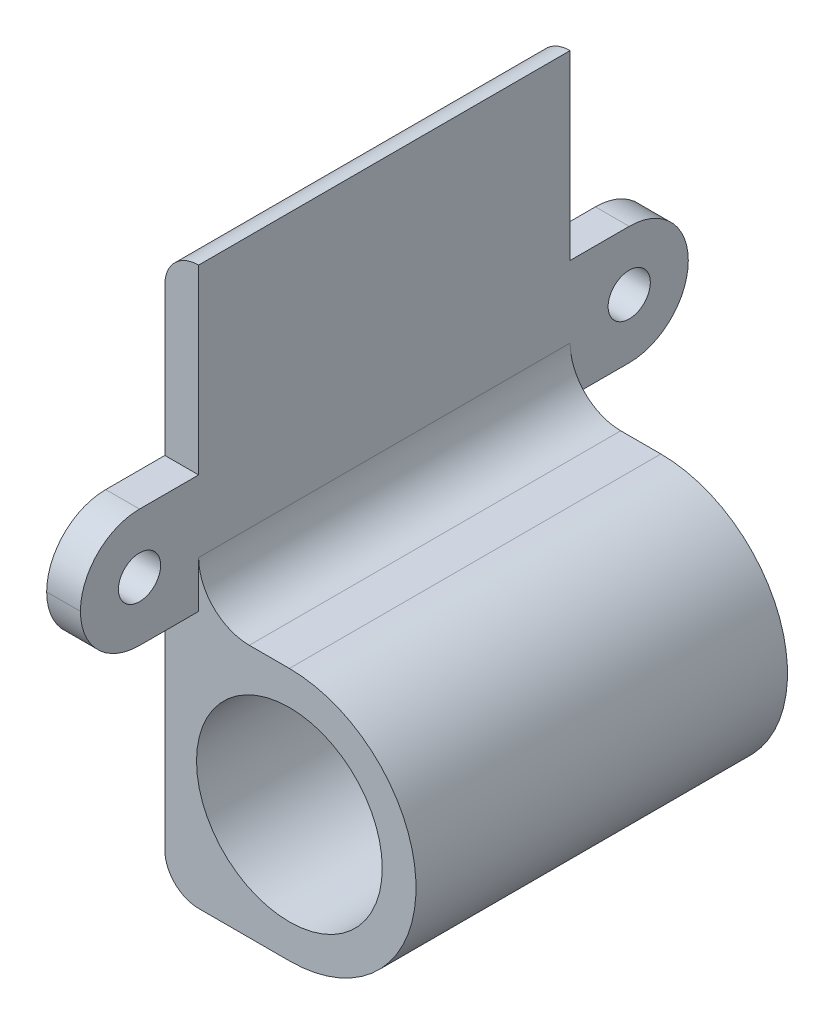
ISO-10303-21;
HEADER;
FILE_DESCRIPTION(('STEP AP214'),'2;1');
FILE_NAME('part.step','',(''),(''),'','','');
FILE_SCHEMA(('AUTOMOTIVE_DESIGN { 1 0 10303 214 1 1 1 1 }'));
ENDSEC;
DATA;
#1=APPLICATION_CONTEXT('core data for automotive mechanical design processes');
#2=APPLICATION_PROTOCOL_DEFINITION('international standard','automotive_design',2000,#1);
#3=PRODUCT_CONTEXT('',#1,'mechanical');
#4=PRODUCT('Part','Part','',(#3));
#5=PRODUCT_RELATED_PRODUCT_CATEGORY('part','',(#4));
#6=PRODUCT_DEFINITION_FORMATION('','',#4);
#7=PRODUCT_DEFINITION_CONTEXT('part definition',#1,'design');
#8=PRODUCT_DEFINITION('design','',#6,#7);
#9=PRODUCT_DEFINITION_SHAPE('','',#8);
#10=(LENGTH_UNIT() NAMED_UNIT(*) SI_UNIT(.MILLI.,.METRE.));
#11=(NAMED_UNIT(*) PLANE_ANGLE_UNIT() SI_UNIT($,.RADIAN.));
#12=(NAMED_UNIT(*) SI_UNIT($,.STERADIAN.) SOLID_ANGLE_UNIT());
#13=UNCERTAINTY_MEASURE_WITH_UNIT(LENGTH_MEASURE(1.E-05),#10,'distance_accuracy_value','');
#14=(GEOMETRIC_REPRESENTATION_CONTEXT(3) GLOBAL_UNCERTAINTY_ASSIGNED_CONTEXT((#13)) GLOBAL_UNIT_ASSIGNED_CONTEXT((#10,
#11,#12)) REPRESENTATION_CONTEXT('',''));
#15=CARTESIAN_POINT('',(0.,0.,0.));
#16=DIRECTION('',(0.,0.,1.));
#17=DIRECTION('',(1.,0.,0.));
#18=AXIS2_PLACEMENT_3D('',#15,#16,#17);
#19=CARTESIAN_POINT('',(14.75,15.,0.));
#20=DIRECTION('',(0.,0.,1.));
#21=DIRECTION('',(1.,0.,0.));
#22=AXIS2_PLACEMENT_3D('',#19,#20,#21);
#23=PLANE('',#22);
#24=CARTESIAN_POINT('',(14.75,15.,0.));
#25=DIRECTION('',(0.,0.,1.));
#26=DIRECTION('',(1.,0.,0.));
#27=AXIS2_PLACEMENT_3D('',#24,#25,#26);
#28=CIRCLE('',#27,11.);
#29=CARTESIAN_POINT('',(25.75,15.,0.));
#30=VERTEX_POINT('',#29);
#31=EDGE_CURVE('E296',#30,#30,#28,.T.);
#32=ORIENTED_EDGE('',*,*,#31,.T.);
#33=EDGE_LOOP('',(#32));
#34=FACE_BOUND('',#33,.T.);
#35=DIRECTION('',(0.,-1.,0.));
#36=VECTOR('',#35,1.);
#37=CARTESIAN_POINT('',(0.,4.,0.));
#38=LINE('',#37,#36);
#39=CARTESIAN_POINT('',(0.,30.4737170086074,0.));
#40=VERTEX_POINT('',#39);
#41=CARTESIAN_POINT('',(0.,4.,0.));
#42=VERTEX_POINT('',#41);
#43=EDGE_CURVE('E190',#40,#42,#38,.T.);
#44=ORIENTED_EDGE('',*,*,#43,.F.);
#45=DIRECTION('',(1.,0.,0.));
#46=VECTOR('',#45,1.);
#47=CARTESIAN_POINT('',(0.,30.4737170086074,0.));
#48=LINE('',#47,#46);
#49=CARTESIAN_POINT('',(4.,30.4737170086074,0.));
#50=VERTEX_POINT('',#49);
#51=EDGE_CURVE('E271',#40,#50,#48,.T.);
#52=ORIENTED_EDGE('',*,*,#51,.T.);
#53=DIRECTION('',(0.,1.,0.));
#54=VECTOR('',#53,1.);
#55=CARTESIAN_POINT('',(4.,30.4737170086074,0.));
#56=LINE('',#55,#54);
#57=CARTESIAN_POINT('',(4.,36.,0.));
#58=VERTEX_POINT('',#57);
#59=EDGE_CURVE('E182',#50,#58,#56,.T.);
#60=ORIENTED_EDGE('',*,*,#59,.T.);
#61=CARTESIAN_POINT('',(10.,36.,0.));
#62=DIRECTION('',(0.,0.,-1.));
#63=DIRECTION('',(1.,0.,0.));
#64=AXIS2_PLACEMENT_3D('',#61,#62,#63);
#65=CIRCLE('',#64,6.);
#66=CARTESIAN_POINT('',(10.0000000000001,30.,0.));
#67=VERTEX_POINT('',#66);
#68=EDGE_CURVE('E188',#67,#58,#65,.T.);
#69=ORIENTED_EDGE('',*,*,#68,.F.);
#70=DIRECTION('',(-1.,0.,0.));
#71=VECTOR('',#70,1.);
#72=CARTESIAN_POINT('',(14.75,30.,0.));
#73=LINE('',#72,#71);
#74=CARTESIAN_POINT('',(14.75,30.,0.));
#75=VERTEX_POINT('',#74);
#76=EDGE_CURVE('E193',#75,#67,#73,.T.);
#77=ORIENTED_EDGE('',*,*,#76,.F.);
#78=CARTESIAN_POINT('',(14.75,15.,0.));
#79=DIRECTION('',(0.,0.,1.));
#80=DIRECTION('',(1.,0.,0.));
#81=AXIS2_PLACEMENT_3D('',#78,#79,#80);
#82=CIRCLE('',#81,15.);
#83=CARTESIAN_POINT('',(14.75,0.,0.));
#84=VERTEX_POINT('',#83);
#85=EDGE_CURVE('E203',#84,#75,#82,.T.);
#86=ORIENTED_EDGE('',*,*,#85,.F.);
#87=DIRECTION('',(1.,0.,0.));
#88=VECTOR('',#87,1.);
#89=CARTESIAN_POINT('',(14.75,0.,0.));
#90=LINE('',#89,#88);
#91=CARTESIAN_POINT('',(4.,0.,0.));
#92=VERTEX_POINT('',#91);
#93=EDGE_CURVE('E201',#92,#84,#90,.T.);
#94=ORIENTED_EDGE('',*,*,#93,.F.);
#95=CARTESIAN_POINT('',(4.,4.,0.));
#96=DIRECTION('',(0.,0.,1.));
#97=DIRECTION('',(1.,0.,0.));
#98=AXIS2_PLACEMENT_3D('',#95,#96,#97);
#99=CIRCLE('',#98,4.);
#100=EDGE_CURVE('E199',#42,#92,#99,.T.);
#101=ORIENTED_EDGE('',*,*,#100,.F.);
#102=EDGE_LOOP('',(#44,#52,#60,#69,#77,#86,#94,#101));
#103=FACE_BOUND('',#102,.T.);
#104=ADVANCED_FACE('F39',(#34,#103),#23,.F.);
#105=CARTESIAN_POINT('',(14.75,15.,44.));
#106=DIRECTION('',(0.,0.,1.));
#107=DIRECTION('',(1.,0.,0.));
#108=AXIS2_PLACEMENT_3D('',#105,#106,#107);
#109=PLANE('',#108);
#110=DIRECTION('',(-1.,0.,0.));
#111=VECTOR('',#110,1.);
#112=CARTESIAN_POINT('',(0.,44.4737170086074,44.));
#113=LINE('',#112,#111);
#114=CARTESIAN_POINT('',(4.00000000000003,44.4737170086074,44.));
#115=VERTEX_POINT('',#114);
#116=CARTESIAN_POINT('',(0.,44.4737170086074,44.));
#117=VERTEX_POINT('',#116);
#118=EDGE_CURVE('E285',#115,#117,#113,.T.);
#119=ORIENTED_EDGE('',*,*,#118,.F.);
#120=DIRECTION('',(0.,1.,0.));
#121=VECTOR('',#120,1.);
#122=CARTESIAN_POINT('',(4.00000000000003,66.,44.));
#123=LINE('',#122,#121);
#124=CARTESIAN_POINT('',(4.00000000000003,66.,44.));
#125=VERTEX_POINT('',#124);
#126=EDGE_CURVE('E308',#115,#125,#123,.T.);
#127=ORIENTED_EDGE('',*,*,#126,.T.);
#128=CARTESIAN_POINT('',(4.,62.,44.));
#129=DIRECTION('',(0.,0.,1.));
#130=DIRECTION('',(-1.,0.,0.));
#131=AXIS2_PLACEMENT_3D('',#128,#129,#130);
#132=CIRCLE('',#131,4.);
#133=CARTESIAN_POINT('',(0.,62.,44.));
#134=VERTEX_POINT('',#133);
#135=EDGE_CURVE('E310',#125,#134,#132,.T.);
#136=ORIENTED_EDGE('',*,*,#135,.T.);
#137=DIRECTION('',(0.,-1.,0.));
#138=VECTOR('',#137,1.);
#139=CARTESIAN_POINT('',(0.,4.,44.));
#140=LINE('',#139,#138);
#141=EDGE_CURVE('E313',#134,#117,#140,.T.);
#142=ORIENTED_EDGE('',*,*,#141,.T.);
#143=EDGE_LOOP('',(#119,#127,#136,#142));
#144=FACE_BOUND('',#143,.T.);
#145=ADVANCED_FACE('F374',(#144),#109,.T.);
#146=DIRECTION('',(0.,1.,0.));
#147=VECTOR('',#146,1.);
#148=CARTESIAN_POINT('',(4.,30.4737170086074,44.));
#149=LINE('',#148,#147);
#150=CARTESIAN_POINT('',(4.,30.4737170086074,44.));
#151=VERTEX_POINT('',#150);
#152=CARTESIAN_POINT('',(4.00000000000003,36.,44.));
#153=VERTEX_POINT('',#152);
#154=EDGE_CURVE('E282',#151,#153,#149,.T.);
#155=ORIENTED_EDGE('',*,*,#154,.F.);
#156=DIRECTION('',(1.,0.,0.));
#157=VECTOR('',#156,1.);
#158=CARTESIAN_POINT('',(0.,30.4737170086074,44.));
#159=LINE('',#158,#157);
#160=CARTESIAN_POINT('',(0.,30.4737170086074,44.));
#161=VERTEX_POINT('',#160);
#162=EDGE_CURVE('E247',#161,#151,#159,.T.);
#163=ORIENTED_EDGE('',*,*,#162,.F.);
#164=CARTESIAN_POINT('',(0.,4.,44.));
#165=VERTEX_POINT('',#164);
#166=EDGE_CURVE('E312',#161,#165,#140,.T.);
#167=ORIENTED_EDGE('',*,*,#166,.T.);
#168=CARTESIAN_POINT('',(4.,4.,44.));
#169=DIRECTION('',(0.,0.,1.));
#170=DIRECTION('',(1.,0.,0.));
#171=AXIS2_PLACEMENT_3D('',#168,#169,#170);
#172=CIRCLE('',#171,4.);
#173=CARTESIAN_POINT('',(4.,0.,44.));
#174=VERTEX_POINT('',#173);
#175=EDGE_CURVE('E316',#165,#174,#172,.T.);
#176=ORIENTED_EDGE('',*,*,#175,.T.);
#177=DIRECTION('',(1.,0.,0.));
#178=VECTOR('',#177,1.);
#179=CARTESIAN_POINT('',(14.75,0.,44.));
#180=LINE('',#179,#178);
#181=CARTESIAN_POINT('',(14.75,0.,44.));
#182=VERTEX_POINT('',#181);
#183=EDGE_CURVE('E210',#174,#182,#180,.T.);
#184=ORIENTED_EDGE('',*,*,#183,.T.);
#185=CARTESIAN_POINT('',(14.75,15.,44.));
#186=DIRECTION('',(0.,0.,1.));
#187=DIRECTION('',(1.,0.,0.));
#188=AXIS2_PLACEMENT_3D('',#185,#186,#187);
#189=CIRCLE('',#188,15.);
#190=CARTESIAN_POINT('',(14.75,30.,44.));
#191=VERTEX_POINT('',#190);
#192=EDGE_CURVE('E205',#182,#191,#189,.T.);
#193=ORIENTED_EDGE('',*,*,#192,.T.);
#194=DIRECTION('',(-1.,0.,0.));
#195=VECTOR('',#194,1.);
#196=CARTESIAN_POINT('',(14.75,30.,44.));
#197=LINE('',#196,#195);
#198=CARTESIAN_POINT('',(10.0000000000001,30.,44.));
#199=VERTEX_POINT('',#198);
#200=EDGE_CURVE('E304',#191,#199,#197,.T.);
#201=ORIENTED_EDGE('',*,*,#200,.T.);
#202=CARTESIAN_POINT('',(10.,36.,44.));
#203=DIRECTION('',(0.,0.,-1.));
#204=DIRECTION('',(1.,0.,0.));
#205=AXIS2_PLACEMENT_3D('',#202,#203,#204);
#206=CIRCLE('',#205,6.);
#207=EDGE_CURVE('E306',#199,#153,#206,.T.);
#208=ORIENTED_EDGE('',*,*,#207,.T.);
#209=EDGE_LOOP('',(#155,#163,#167,#176,#184,#193,#201,#208));
#210=FACE_BOUND('',#209,.T.);
#211=CARTESIAN_POINT('',(14.75,15.,44.));
#212=DIRECTION('',(0.,0.,1.));
#213=DIRECTION('',(1.,0.,0.));
#214=AXIS2_PLACEMENT_3D('',#211,#212,#213);
#215=CIRCLE('',#214,11.);
#216=CARTESIAN_POINT('',(25.75,15.,44.));
#217=VERTEX_POINT('',#216);
#218=EDGE_CURVE('E297',#217,#217,#215,.T.);
#219=ORIENTED_EDGE('',*,*,#218,.F.);
#220=EDGE_LOOP('',(#219));
#221=FACE_BOUND('',#220,.T.);
#222=ADVANCED_FACE('F338',(#210,#221),#109,.T.);
#223=DIRECTION('',(0.,1.,0.));
#224=VECTOR('',#223,1.);
#225=CARTESIAN_POINT('',(4.00000000000003,66.,0.));
#226=LINE('',#225,#224);
#227=CARTESIAN_POINT('',(4.,44.4737170086074,0.));
#228=VERTEX_POINT('',#227);
#229=CARTESIAN_POINT('',(4.00000000000003,66.,0.));
#230=VERTEX_POINT('',#229);
#231=EDGE_CURVE('E169',#228,#230,#226,.T.);
#232=ORIENTED_EDGE('',*,*,#231,.F.);
#233=DIRECTION('',(-1.,0.,0.));
#234=VECTOR('',#233,1.);
#235=CARTESIAN_POINT('',(0.,44.4737170086074,0.));
#236=LINE('',#235,#234);
#237=CARTESIAN_POINT('',(0.,44.4737170086074,0.));
#238=VERTEX_POINT('',#237);
#239=EDGE_CURVE('E177',#228,#238,#236,.T.);
#240=ORIENTED_EDGE('',*,*,#239,.T.);
#241=CARTESIAN_POINT('',(0.,62.,0.));
#242=VERTEX_POINT('',#241);
#243=EDGE_CURVE('E197',#242,#238,#38,.T.);
#244=ORIENTED_EDGE('',*,*,#243,.F.);
#245=CARTESIAN_POINT('',(4.,62.,0.));
#246=DIRECTION('',(0.,0.,1.));
#247=DIRECTION('',(-1.,0.,0.));
#248=AXIS2_PLACEMENT_3D('',#245,#246,#247);
#249=CIRCLE('',#248,4.);
#250=EDGE_CURVE('E187',#230,#242,#249,.T.);
#251=ORIENTED_EDGE('',*,*,#250,.F.);
#252=EDGE_LOOP('',(#232,#240,#244,#251));
#253=FACE_BOUND('',#252,.T.);
#254=ADVANCED_FACE('F186',(#253),#23,.F.);
#255=CARTESIAN_POINT('',(14.75,30.,44.));
#256=DIRECTION('',(0.,-1.,0.));
#257=DIRECTION('',(0.,0.,-1.));
#258=AXIS2_PLACEMENT_3D('',#255,#256,#257);
#259=PLANE('',#258);
#260=ORIENTED_EDGE('',*,*,#76,.T.);
#261=DIRECTION('',(0.,0.,-1.));
#262=VECTOR('',#261,1.);
#263=CARTESIAN_POINT('',(10.0000000000001,30.,44.));
#264=LINE('',#263,#262);
#265=EDGE_CURVE('E224',#199,#67,#264,.T.);
#266=ORIENTED_EDGE('',*,*,#265,.F.);
#267=ORIENTED_EDGE('',*,*,#200,.F.);
#268=DIRECTION('',(0.,0.,-1.));
#269=VECTOR('',#268,1.);
#270=CARTESIAN_POINT('',(14.75,30.,44.));
#271=LINE('',#270,#269);
#272=EDGE_CURVE('E227',#191,#75,#271,.T.);
#273=ORIENTED_EDGE('',*,*,#272,.T.);
#274=EDGE_LOOP('',(#260,#266,#267,#273));
#275=FACE_BOUND('',#274,.T.);
#276=ADVANCED_FACE('F322',(#275),#259,.F.);
#277=CARTESIAN_POINT('',(10.,36.,44.));
#278=DIRECTION('',(0.,0.,-1.));
#279=DIRECTION('',(-1.,0.,0.));
#280=AXIS2_PLACEMENT_3D('',#277,#278,#279);
#281=CYLINDRICAL_SURFACE('',#280,6.);
#282=ORIENTED_EDGE('',*,*,#68,.T.);
#283=DIRECTION('',(0.,0.,-1.));
#284=VECTOR('',#283,1.);
#285=CARTESIAN_POINT('',(4.00000000000003,36.,44.));
#286=LINE('',#285,#284);
#287=EDGE_CURVE('E221',#153,#58,#286,.T.);
#288=ORIENTED_EDGE('',*,*,#287,.F.);
#289=ORIENTED_EDGE('',*,*,#207,.F.);
#290=ORIENTED_EDGE('',*,*,#265,.T.);
#291=EDGE_LOOP('',(#282,#288,#289,#290));
#292=FACE_BOUND('',#291,.T.);
#293=ADVANCED_FACE('F329',(#292),#281,.F.);
#294=CARTESIAN_POINT('',(4.00000000000003,66.,44.));
#295=DIRECTION('',(-1.,0.,0.));
#296=DIRECTION('',(0.,0.,1.));
#297=AXIS2_PLACEMENT_3D('',#294,#295,#296);
#298=PLANE('',#297);
#299=CARTESIAN_POINT('',(4.00000000000003,37.4737170086074,-7.));
#300=DIRECTION('',(-1.,0.,0.));
#301=DIRECTION('',(0.,1.,0.));
#302=AXIS2_PLACEMENT_3D('',#299,#300,#301);
#303=CIRCLE('',#302,2.5);
#304=CARTESIAN_POINT('',(4.00000000000003,39.9737170086074,-7.));
#305=VERTEX_POINT('',#304);
#306=EDGE_CURVE('E262',#305,#305,#303,.T.);
#307=ORIENTED_EDGE('',*,*,#306,.T.);
#308=EDGE_LOOP('',(#307));
#309=FACE_BOUND('',#308,.T.);
#310=CARTESIAN_POINT('',(4.00000000000003,37.4737170086074,51.));
#311=DIRECTION('',(1.,0.,0.));
#312=DIRECTION('',(0.,1.,0.));
#313=AXIS2_PLACEMENT_3D('',#310,#311,#312);
#314=CIRCLE('',#313,2.5);
#315=CARTESIAN_POINT('',(4.00000000000003,39.9737170086074,51.));
#316=VERTEX_POINT('',#315);
#317=EDGE_CURVE('E251',#316,#316,#314,.T.);
#318=ORIENTED_EDGE('',*,*,#317,.F.);
#319=EDGE_LOOP('',(#318));
#320=FACE_BOUND('',#319,.T.);
#321=DIRECTION('',(0.,0.,1.));
#322=VECTOR('',#321,1.);
#323=CARTESIAN_POINT('',(4.,30.4737170086074,-14.));
#324=LINE('',#323,#322);
#325=CARTESIAN_POINT('',(4.,30.4737170086074,-7.));
#326=VERTEX_POINT('',#325);
#327=EDGE_CURVE('E174',#326,#50,#324,.T.);
#328=ORIENTED_EDGE('',*,*,#327,.F.);
#329=CARTESIAN_POINT('',(4.00000000000003,37.4737170086074,-7.));
#330=DIRECTION('',(-1.,0.,0.));
#331=DIRECTION('',(0.,0.,1.));
#332=AXIS2_PLACEMENT_3D('',#329,#330,#331);
#333=CIRCLE('',#332,7.);
#334=CARTESIAN_POINT('',(4.,37.4737170086074,-14.));
#335=VERTEX_POINT('',#334);
#336=EDGE_CURVE('E255',#326,#335,#333,.F.);
#337=ORIENTED_EDGE('',*,*,#336,.T.);
#338=CARTESIAN_POINT('',(4.00000000000003,37.4737170086074,-7.));
#339=DIRECTION('',(-1.,0.,0.));
#340=DIRECTION('',(0.,0.,1.));
#341=AXIS2_PLACEMENT_3D('',#338,#339,#340);
#342=CIRCLE('',#341,7.);
#343=CARTESIAN_POINT('',(4.,44.4737170086074,-7.));
#344=VERTEX_POINT('',#343);
#345=EDGE_CURVE('E172',#335,#344,#342,.F.);
#346=ORIENTED_EDGE('',*,*,#345,.T.);
#347=DIRECTION('',(0.,0.,1.));
#348=VECTOR('',#347,1.);
#349=CARTESIAN_POINT('',(4.,44.4737170086074,-14.));
#350=LINE('',#349,#348);
#351=EDGE_CURVE('E163',#344,#228,#350,.T.);
#352=ORIENTED_EDGE('',*,*,#351,.T.);
#353=ORIENTED_EDGE('',*,*,#231,.T.);
#354=DIRECTION('',(0.,0.,-1.));
#355=VECTOR('',#354,1.);
#356=CARTESIAN_POINT('',(4.00000000000003,66.,44.));
#357=LINE('',#356,#355);
#358=EDGE_CURVE('E219',#125,#230,#357,.T.);
#359=ORIENTED_EDGE('',*,*,#358,.F.);
#360=ORIENTED_EDGE('',*,*,#126,.F.);
#361=DIRECTION('',(0.,0.,-1.));
#362=VECTOR('',#361,1.);
#363=CARTESIAN_POINT('',(4.,44.4737170086074,58.));
#364=LINE('',#363,#362);
#365=CARTESIAN_POINT('',(4.,44.4737170086074,51.));
#366=VERTEX_POINT('',#365);
#367=EDGE_CURVE('E290',#366,#115,#364,.T.);
#368=ORIENTED_EDGE('',*,*,#367,.F.);
#369=CARTESIAN_POINT('',(4.00000000000003,37.4737170086074,51.));
#370=DIRECTION('',(-1.,0.,0.));
#371=DIRECTION('',(0.,0.,1.));
#372=AXIS2_PLACEMENT_3D('',#369,#370,#371);
#373=CIRCLE('',#372,7.);
#374=CARTESIAN_POINT('',(4.,37.4737170086074,58.));
#375=VERTEX_POINT('',#374);
#376=EDGE_CURVE('E230',#366,#375,#373,.F.);
#377=ORIENTED_EDGE('',*,*,#376,.T.);
#378=CARTESIAN_POINT('',(4.00000000000003,37.4737170086074,51.));
#379=DIRECTION('',(-1.,0.,0.));
#380=DIRECTION('',(0.,0.,1.));
#381=AXIS2_PLACEMENT_3D('',#378,#379,#380);
#382=CIRCLE('',#381,7.);
#383=CARTESIAN_POINT('',(4.,30.4737170086074,51.));
#384=VERTEX_POINT('',#383);
#385=EDGE_CURVE('E232',#375,#384,#382,.F.);
#386=ORIENTED_EDGE('',*,*,#385,.T.);
#387=DIRECTION('',(0.,0.,-1.));
#388=VECTOR('',#387,1.);
#389=CARTESIAN_POINT('',(4.,30.4737170086074,58.));
#390=LINE('',#389,#388);
#391=EDGE_CURVE('E292',#384,#151,#390,.T.);
#392=ORIENTED_EDGE('',*,*,#391,.T.);
#393=ORIENTED_EDGE('',*,*,#154,.T.);
#394=ORIENTED_EDGE('',*,*,#287,.T.);
#395=ORIENTED_EDGE('',*,*,#59,.F.);
#396=EDGE_LOOP('',(#328,#337,#346,#352,#353,#359,#360,#368,#377,#386,#392,#393,#394,#395));
#397=FACE_BOUND('',#396,.T.);
#398=ADVANCED_FACE('F166',(#309,#320,#397),#298,.F.);
#399=CARTESIAN_POINT('',(4.,62.,44.));
#400=DIRECTION('',(0.,0.,-1.));
#401=DIRECTION('',(-1.,0.,0.));
#402=AXIS2_PLACEMENT_3D('',#399,#400,#401);
#403=CYLINDRICAL_SURFACE('',#402,4.);
#404=ORIENTED_EDGE('',*,*,#250,.T.);
#405=DIRECTION('',(0.,0.,-1.));
#406=VECTOR('',#405,1.);
#407=CARTESIAN_POINT('',(0.,62.,44.));
#408=LINE('',#407,#406);
#409=EDGE_CURVE('E216',#134,#242,#408,.T.);
#410=ORIENTED_EDGE('',*,*,#409,.F.);
#411=ORIENTED_EDGE('',*,*,#135,.F.);
#412=ORIENTED_EDGE('',*,*,#358,.T.);
#413=EDGE_LOOP('',(#404,#410,#411,#412));
#414=FACE_BOUND('',#413,.T.);
#415=ADVANCED_FACE('F446',(#414),#403,.T.);
#416=CARTESIAN_POINT('',(0.,4.,44.));
#417=DIRECTION('',(1.,0.,0.));
#418=DIRECTION('',(0.,1.,0.));
#419=AXIS2_PLACEMENT_3D('',#416,#417,#418);
#420=PLANE('',#419);
#421=CARTESIAN_POINT('',(0.,37.4737170086074,-7.));
#422=DIRECTION('',(1.,0.,0.));
#423=DIRECTION('',(0.,1.,0.));
#424=AXIS2_PLACEMENT_3D('',#421,#422,#423);
#425=CIRCLE('',#424,2.5);
#426=CARTESIAN_POINT('',(0.,39.9737170086074,-7.));
#427=VERTEX_POINT('',#426);
#428=EDGE_CURVE('E43',#427,#427,#425,.F.);
#429=ORIENTED_EDGE('',*,*,#428,.F.);
#430=EDGE_LOOP('',(#429));
#431=FACE_BOUND('',#430,.T.);
#432=CARTESIAN_POINT('',(0.,37.4737170086074,51.));
#433=DIRECTION('',(1.,0.,0.));
#434=DIRECTION('',(0.,1.,0.));
#435=AXIS2_PLACEMENT_3D('',#432,#433,#434);
#436=CIRCLE('',#435,2.5);
#437=CARTESIAN_POINT('',(0.,39.9737170086074,51.));
#438=VERTEX_POINT('',#437);
#439=EDGE_CURVE('E248',#438,#438,#436,.T.);
#440=ORIENTED_EDGE('',*,*,#439,.T.);
#441=EDGE_LOOP('',(#440));
#442=FACE_BOUND('',#441,.T.);
#443=CARTESIAN_POINT('',(0.,37.4737170086074,-7.));
#444=DIRECTION('',(1.,0.,0.));
#445=DIRECTION('',(0.,1.,0.));
#446=AXIS2_PLACEMENT_3D('',#443,#444,#445);
#447=CIRCLE('',#446,7.);
#448=CARTESIAN_POINT('',(0.,44.4737170086074,-7.));
#449=VERTEX_POINT('',#448);
#450=CARTESIAN_POINT('',(0.,37.4737170086074,-14.));
#451=VERTEX_POINT('',#450);
#452=EDGE_CURVE('E56',#449,#451,#447,.F.);
#453=ORIENTED_EDGE('',*,*,#452,.T.);
#454=CARTESIAN_POINT('',(0.,37.4737170086074,-7.));
#455=DIRECTION('',(1.,0.,0.));
#456=DIRECTION('',(0.,1.,0.));
#457=AXIS2_PLACEMENT_3D('',#454,#455,#456);
#458=CIRCLE('',#457,7.);
#459=CARTESIAN_POINT('',(0.,30.4737170086074,-7.));
#460=VERTEX_POINT('',#459);
#461=EDGE_CURVE('E48',#451,#460,#458,.F.);
#462=ORIENTED_EDGE('',*,*,#461,.T.);
#463=DIRECTION('',(0.,0.,1.));
#464=VECTOR('',#463,1.);
#465=CARTESIAN_POINT('',(0.,30.4737170086074,-14.));
#466=LINE('',#465,#464);
#467=EDGE_CURVE('E274',#460,#40,#466,.T.);
#468=ORIENTED_EDGE('',*,*,#467,.T.);
#469=ORIENTED_EDGE('',*,*,#43,.T.);
#470=DIRECTION('',(0.,0.,-1.));
#471=VECTOR('',#470,1.);
#472=CARTESIAN_POINT('',(0.,4.,44.));
#473=LINE('',#472,#471);
#474=EDGE_CURVE('E213',#165,#42,#473,.T.);
#475=ORIENTED_EDGE('',*,*,#474,.F.);
#476=ORIENTED_EDGE('',*,*,#166,.F.);
#477=DIRECTION('',(0.,0.,-1.));
#478=VECTOR('',#477,1.);
#479=CARTESIAN_POINT('',(0.,30.4737170086074,58.));
#480=LINE('',#479,#478);
#481=CARTESIAN_POINT('',(0.,30.4737170086074,51.));
#482=VERTEX_POINT('',#481);
#483=EDGE_CURVE('E294',#482,#161,#480,.T.);
#484=ORIENTED_EDGE('',*,*,#483,.F.);
#485=CARTESIAN_POINT('',(0.,37.4737170086074,51.));
#486=DIRECTION('',(1.,0.,0.));
#487=DIRECTION('',(0.,1.,0.));
#488=AXIS2_PLACEMENT_3D('',#485,#486,#487);
#489=CIRCLE('',#488,7.);
#490=CARTESIAN_POINT('',(0.,37.4737170086074,58.));
#491=VERTEX_POINT('',#490);
#492=EDGE_CURVE('E239',#482,#491,#489,.F.);
#493=ORIENTED_EDGE('',*,*,#492,.T.);
#494=CARTESIAN_POINT('',(0.,37.4737170086074,51.));
#495=DIRECTION('',(1.,0.,0.));
#496=DIRECTION('',(0.,1.,0.));
#497=AXIS2_PLACEMENT_3D('',#494,#495,#496);
#498=CIRCLE('',#497,7.);
#499=CARTESIAN_POINT('',(0.,44.4737170086074,51.));
#500=VERTEX_POINT('',#499);
#501=EDGE_CURVE('E237',#491,#500,#498,.F.);
#502=ORIENTED_EDGE('',*,*,#501,.T.);
#503=DIRECTION('',(0.,0.,-1.));
#504=VECTOR('',#503,1.);
#505=CARTESIAN_POINT('',(0.,44.4737170086074,58.));
#506=LINE('',#505,#504);
#507=EDGE_CURVE('E288',#500,#117,#506,.T.);
#508=ORIENTED_EDGE('',*,*,#507,.T.);
#509=ORIENTED_EDGE('',*,*,#141,.F.);
#510=ORIENTED_EDGE('',*,*,#409,.T.);
#511=ORIENTED_EDGE('',*,*,#243,.T.);
#512=DIRECTION('',(0.,0.,1.));
#513=VECTOR('',#512,1.);
#514=CARTESIAN_POINT('',(0.,44.4737170086074,-14.));
#515=LINE('',#514,#513);
#516=EDGE_CURVE('E173',#449,#238,#515,.T.);
#517=ORIENTED_EDGE('',*,*,#516,.F.);
#518=EDGE_LOOP('',(#453,#462,#468,#469,#475,#476,#484,#493,#502,#508,#509,#510,#511,#517));
#519=FACE_BOUND('',#518,.T.);
#520=ADVANCED_FACE('F345',(#431,#442,#519),#420,.F.);
#521=CARTESIAN_POINT('',(4.,4.,44.));
#522=DIRECTION('',(0.,0.,-1.));
#523=DIRECTION('',(-1.,0.,0.));
#524=AXIS2_PLACEMENT_3D('',#521,#522,#523);
#525=CYLINDRICAL_SURFACE('',#524,4.);
#526=ORIENTED_EDGE('',*,*,#100,.T.);
#527=DIRECTION('',(0.,0.,-1.));
#528=VECTOR('',#527,1.);
#529=CARTESIAN_POINT('',(4.,0.,44.));
#530=LINE('',#529,#528);
#531=EDGE_CURVE('E209',#174,#92,#530,.T.);
#532=ORIENTED_EDGE('',*,*,#531,.F.);
#533=ORIENTED_EDGE('',*,*,#175,.F.);
#534=ORIENTED_EDGE('',*,*,#474,.T.);
#535=EDGE_LOOP('',(#526,#532,#533,#534));
#536=FACE_BOUND('',#535,.T.);
#537=ADVANCED_FACE('F353',(#536),#525,.T.);
#538=CARTESIAN_POINT('',(14.75,0.,44.));
#539=DIRECTION('',(0.,1.,0.));
#540=DIRECTION('',(-1.,0.,0.));
#541=AXIS2_PLACEMENT_3D('',#538,#539,#540);
#542=PLANE('',#541);
#543=ORIENTED_EDGE('',*,*,#93,.T.);
#544=DIRECTION('',(0.,0.,-1.));
#545=VECTOR('',#544,1.);
#546=CARTESIAN_POINT('',(14.75,0.,44.));
#547=LINE('',#546,#545);
#548=EDGE_CURVE('E206',#182,#84,#547,.T.);
#549=ORIENTED_EDGE('',*,*,#548,.F.);
#550=ORIENTED_EDGE('',*,*,#183,.F.);
#551=ORIENTED_EDGE('',*,*,#531,.T.);
#552=EDGE_LOOP('',(#543,#549,#550,#551));
#553=FACE_BOUND('',#552,.T.);
#554=ADVANCED_FACE('F357',(#553),#542,.F.);
#555=CARTESIAN_POINT('',(14.75,15.,44.));
#556=DIRECTION('',(0.,0.,-1.));
#557=DIRECTION('',(-1.,0.,0.));
#558=AXIS2_PLACEMENT_3D('',#555,#556,#557);
#559=CYLINDRICAL_SURFACE('',#558,15.);
#560=ORIENTED_EDGE('',*,*,#85,.T.);
#561=ORIENTED_EDGE('',*,*,#272,.F.);
#562=ORIENTED_EDGE('',*,*,#192,.F.);
#563=ORIENTED_EDGE('',*,*,#548,.T.);
#564=EDGE_LOOP('',(#560,#561,#562,#563));
#565=FACE_BOUND('',#564,.T.);
#566=ADVANCED_FACE('F359',(#565),#559,.T.);
#567=CARTESIAN_POINT('',(14.75,15.,44.));
#568=DIRECTION('',(0.,0.,-1.));
#569=DIRECTION('',(-1.,0.,0.));
#570=AXIS2_PLACEMENT_3D('',#567,#568,#569);
#571=CYLINDRICAL_SURFACE('',#570,11.);
#572=ORIENTED_EDGE('',*,*,#218,.T.);
#573=EDGE_LOOP('',(#572));
#574=FACE_BOUND('',#573,.T.);
#575=ORIENTED_EDGE('',*,*,#31,.F.);
#576=EDGE_LOOP('',(#575));
#577=FACE_BOUND('',#576,.T.);
#578=ADVANCED_FACE('F395',(#574,#577),#571,.F.);
#579=CARTESIAN_POINT('',(0.,30.4737170086074,58.));
#580=DIRECTION('',(0.,1.,0.));
#581=DIRECTION('',(-1.,0.,0.));
#582=AXIS2_PLACEMENT_3D('',#579,#580,#581);
#583=PLANE('',#582);
#584=ORIENTED_EDGE('',*,*,#391,.F.);
#585=DIRECTION('',(1.,0.,0.));
#586=VECTOR('',#585,1.);
#587=CARTESIAN_POINT('',(0.,30.4737170086074,51.));
#588=LINE('',#587,#586);
#589=EDGE_CURVE('E234',#384,#482,#588,.F.);
#590=ORIENTED_EDGE('',*,*,#589,.T.);
#591=ORIENTED_EDGE('',*,*,#483,.T.);
#592=ORIENTED_EDGE('',*,*,#162,.T.);
#593=EDGE_LOOP('',(#584,#590,#591,#592));
#594=FACE_BOUND('',#593,.T.);
#595=ADVANCED_FACE('F342',(#594),#583,.F.);
#596=CARTESIAN_POINT('',(0.,44.4737170086074,58.));
#597=DIRECTION('',(0.,-1.,0.));
#598=DIRECTION('',(1.,0.,0.));
#599=AXIS2_PLACEMENT_3D('',#596,#597,#598);
#600=PLANE('',#599);
#601=ORIENTED_EDGE('',*,*,#507,.F.);
#602=DIRECTION('',(-1.,0.,0.));
#603=VECTOR('',#602,1.);
#604=CARTESIAN_POINT('',(0.,44.4737170086074,51.));
#605=LINE('',#604,#603);
#606=EDGE_CURVE('E241',#500,#366,#605,.F.);
#607=ORIENTED_EDGE('',*,*,#606,.T.);
#608=ORIENTED_EDGE('',*,*,#367,.T.);
#609=ORIENTED_EDGE('',*,*,#118,.T.);
#610=EDGE_LOOP('',(#601,#607,#608,#609));
#611=FACE_BOUND('',#610,.T.);
#612=ADVANCED_FACE('F400',(#611),#600,.F.);
#613=CARTESIAN_POINT('',(0.,37.4737170086074,51.));
#614=DIRECTION('',(-1.,0.,0.));
#615=DIRECTION('',(0.,-1.,0.));
#616=AXIS2_PLACEMENT_3D('',#613,#614,#615);
#617=CYLINDRICAL_SURFACE('',#616,7.);
#618=ORIENTED_EDGE('',*,*,#606,.F.);
#619=ORIENTED_EDGE('',*,*,#501,.F.);
#620=DIRECTION('',(-1.,0.,0.));
#621=VECTOR('',#620,1.);
#622=CARTESIAN_POINT('',(0.,37.4737170086074,58.));
#623=LINE('',#622,#621);
#624=EDGE_CURVE('E244',#375,#491,#623,.T.);
#625=ORIENTED_EDGE('',*,*,#624,.F.);
#626=ORIENTED_EDGE('',*,*,#376,.F.);
#627=EDGE_LOOP('',(#618,#619,#625,#626));
#628=FACE_BOUND('',#627,.T.);
#629=ADVANCED_FACE('F403',(#628),#617,.T.);
#630=CARTESIAN_POINT('',(0.,37.4737170086074,51.));
#631=DIRECTION('',(1.,0.,0.));
#632=DIRECTION('',(0.,1.,0.));
#633=AXIS2_PLACEMENT_3D('',#630,#631,#632);
#634=CYLINDRICAL_SURFACE('',#633,7.);
#635=ORIENTED_EDGE('',*,*,#492,.F.);
#636=ORIENTED_EDGE('',*,*,#589,.F.);
#637=ORIENTED_EDGE('',*,*,#385,.F.);
#638=ORIENTED_EDGE('',*,*,#624,.T.);
#639=EDGE_LOOP('',(#635,#636,#637,#638));
#640=FACE_BOUND('',#639,.T.);
#641=ADVANCED_FACE('F407',(#640),#634,.T.);
#642=CARTESIAN_POINT('',(-9.99999999999997,37.4737170086074,51.));
#643=DIRECTION('',(1.,0.,0.));
#644=DIRECTION('',(0.,1.,0.));
#645=AXIS2_PLACEMENT_3D('',#642,#643,#644);
#646=CYLINDRICAL_SURFACE('',#645,2.5);
#647=ORIENTED_EDGE('',*,*,#317,.T.);
#648=EDGE_LOOP('',(#647));
#649=FACE_BOUND('',#648,.T.);
#650=ORIENTED_EDGE('',*,*,#439,.F.);
#651=EDGE_LOOP('',(#650));
#652=FACE_BOUND('',#651,.T.);
#653=ADVANCED_FACE('F405',(#649,#652),#646,.F.);
#654=CARTESIAN_POINT('',(0.,44.4737170086074,-14.));
#655=DIRECTION('',(0.,1.,0.));
#656=DIRECTION('',(-1.,0.,0.));
#657=AXIS2_PLACEMENT_3D('',#654,#655,#656);
#658=PLANE('',#657);
#659=ORIENTED_EDGE('',*,*,#351,.F.);
#660=DIRECTION('',(-1.,0.,0.));
#661=VECTOR('',#660,1.);
#662=CARTESIAN_POINT('',(0.,44.4737170086074,-7.));
#663=LINE('',#662,#661);
#664=EDGE_CURVE('E11',#344,#449,#663,.T.);
#665=ORIENTED_EDGE('',*,*,#664,.T.);
#666=ORIENTED_EDGE('',*,*,#516,.T.);
#667=ORIENTED_EDGE('',*,*,#239,.F.);
#668=EDGE_LOOP('',(#659,#665,#666,#667));
#669=FACE_BOUND('',#668,.T.);
#670=ADVANCED_FACE('F178',(#669),#658,.T.);
#671=CARTESIAN_POINT('',(0.,30.4737170086074,-14.));
#672=DIRECTION('',(0.,-1.,0.));
#673=DIRECTION('',(1.,0.,0.));
#674=AXIS2_PLACEMENT_3D('',#671,#672,#673);
#675=PLANE('',#674);
#676=ORIENTED_EDGE('',*,*,#467,.F.);
#677=DIRECTION('',(1.,0.,0.));
#678=VECTOR('',#677,1.);
#679=CARTESIAN_POINT('',(4.,30.4737170086074,-7.));
#680=LINE('',#679,#678);
#681=EDGE_CURVE('E243',#460,#326,#680,.T.);
#682=ORIENTED_EDGE('',*,*,#681,.T.);
#683=ORIENTED_EDGE('',*,*,#327,.T.);
#684=ORIENTED_EDGE('',*,*,#51,.F.);
#685=EDGE_LOOP('',(#676,#682,#683,#684));
#686=FACE_BOUND('',#685,.T.);
#687=ADVANCED_FACE('F363',(#686),#675,.T.);
#688=CARTESIAN_POINT('',(0.,37.4737170086074,-7.));
#689=DIRECTION('',(1.,0.,0.));
#690=DIRECTION('',(0.,1.,0.));
#691=AXIS2_PLACEMENT_3D('',#688,#689,#690);
#692=CYLINDRICAL_SURFACE('',#691,7.);
#693=DIRECTION('',(-1.,0.,0.));
#694=VECTOR('',#693,1.);
#695=CARTESIAN_POINT('',(4.00000000000001,37.4737170086074,-14.));
#696=LINE('',#695,#694);
#697=EDGE_CURVE('E183',#451,#335,#696,.F.);
#698=ORIENTED_EDGE('',*,*,#697,.F.);
#699=ORIENTED_EDGE('',*,*,#452,.F.);
#700=ORIENTED_EDGE('',*,*,#664,.F.);
#701=ORIENTED_EDGE('',*,*,#345,.F.);
#702=EDGE_LOOP('',(#698,#699,#700,#701));
#703=FACE_BOUND('',#702,.T.);
#704=ADVANCED_FACE('F41',(#703),#692,.T.);
#705=CARTESIAN_POINT('',(0.,37.4737170086074,-7.));
#706=DIRECTION('',(-1.,0.,0.));
#707=DIRECTION('',(0.,-1.,0.));
#708=AXIS2_PLACEMENT_3D('',#705,#706,#707);
#709=CYLINDRICAL_SURFACE('',#708,7.);
#710=ORIENTED_EDGE('',*,*,#461,.F.);
#711=ORIENTED_EDGE('',*,*,#697,.T.);
#712=ORIENTED_EDGE('',*,*,#336,.F.);
#713=ORIENTED_EDGE('',*,*,#681,.F.);
#714=EDGE_LOOP('',(#710,#711,#712,#713));
#715=FACE_BOUND('',#714,.T.);
#716=ADVANCED_FACE('F364',(#715),#709,.T.);
#717=CARTESIAN_POINT('',(-9.99999999999997,37.4737170086074,-7.));
#718=DIRECTION('',(1.,0.,0.));
#719=DIRECTION('',(0.,1.,0.));
#720=AXIS2_PLACEMENT_3D('',#717,#718,#719);
#721=CYLINDRICAL_SURFACE('',#720,2.5);
#722=ORIENTED_EDGE('',*,*,#306,.F.);
#723=EDGE_LOOP('',(#722));
#724=FACE_BOUND('',#723,.T.);
#725=ORIENTED_EDGE('',*,*,#428,.T.);
#726=EDGE_LOOP('',(#725));
#727=FACE_BOUND('',#726,.T.);
#728=ADVANCED_FACE('F371',(#724,#727),#721,.F.);
#729=CLOSED_SHELL('',(#104,#145,#222,#254,#276,#293,#398,#415,#520,#537,#554,#566,#578,#595,
#612,#629,#641,#653,#670,#687,#704,#716,#728));
#730=MANIFOLD_SOLID_BREP('B2',#729);
#731=ADVANCED_BREP_SHAPE_REPRESENTATION('',(#18,#730),#14);
#732=SHAPE_DEFINITION_REPRESENTATION(#9,#731);
ENDSEC;
END-ISO-10303-21;
